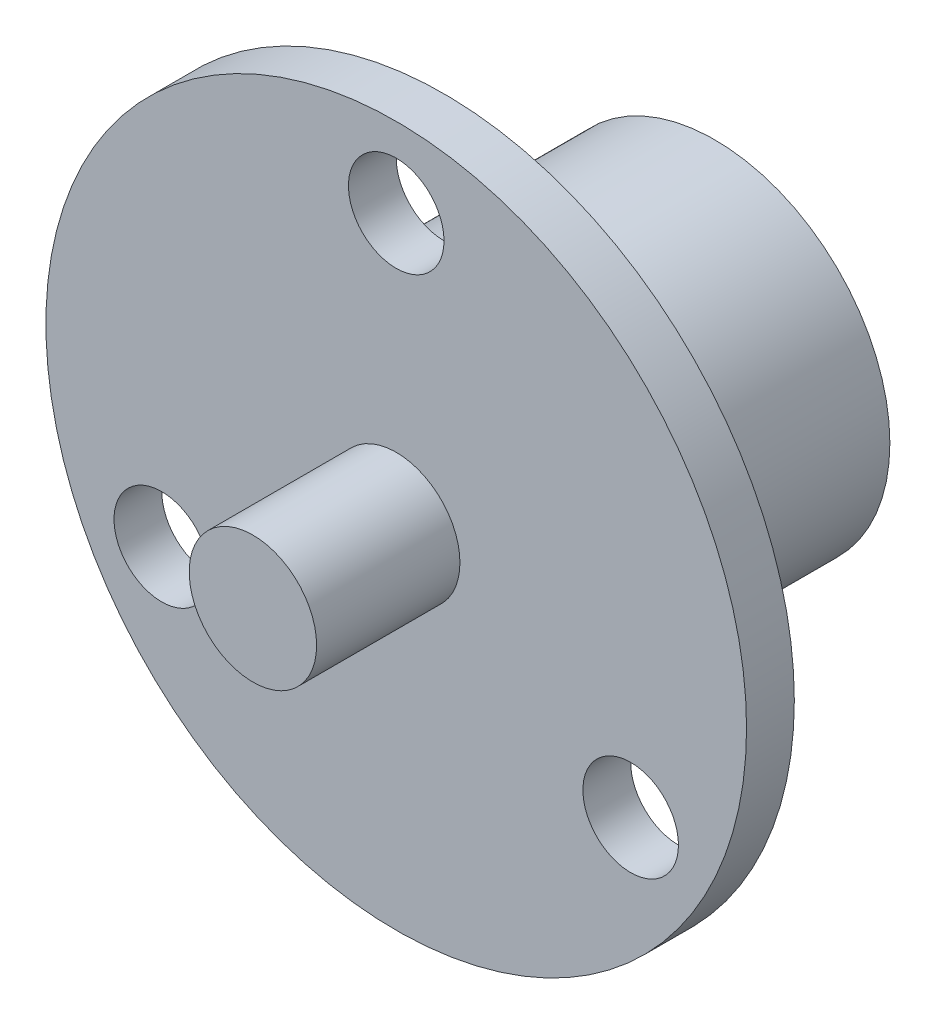
ISO-10303-21;
HEADER;
FILE_DESCRIPTION(('STEP AP214'),'2;1');
FILE_NAME('part.step','',(''),(''),'','','');
FILE_SCHEMA(('AUTOMOTIVE_DESIGN { 1 0 10303 214 1 1 1 1 }'));
ENDSEC;
DATA;
#1=APPLICATION_CONTEXT('core data for automotive mechanical design processes');
#2=APPLICATION_PROTOCOL_DEFINITION('international standard','automotive_design',2000,#1);
#3=PRODUCT_CONTEXT('',#1,'mechanical');
#4=PRODUCT('Part','Part','',(#3));
#5=PRODUCT_RELATED_PRODUCT_CATEGORY('part','',(#4));
#6=PRODUCT_DEFINITION_FORMATION('','',#4);
#7=PRODUCT_DEFINITION_CONTEXT('part definition',#1,'design');
#8=PRODUCT_DEFINITION('design','',#6,#7);
#9=PRODUCT_DEFINITION_SHAPE('','',#8);
#10=(LENGTH_UNIT() NAMED_UNIT(*) SI_UNIT(.MILLI.,.METRE.));
#11=(NAMED_UNIT(*) PLANE_ANGLE_UNIT() SI_UNIT($,.RADIAN.));
#12=(NAMED_UNIT(*) SI_UNIT($,.STERADIAN.) SOLID_ANGLE_UNIT());
#13=UNCERTAINTY_MEASURE_WITH_UNIT(LENGTH_MEASURE(1.E-05),#10,'distance_accuracy_value','');
#14=(GEOMETRIC_REPRESENTATION_CONTEXT(3) GLOBAL_UNCERTAINTY_ASSIGNED_CONTEXT((#13)) GLOBAL_UNIT_ASSIGNED_CONTEXT((#10,
#11,#12)) REPRESENTATION_CONTEXT('',''));
#15=CARTESIAN_POINT('',(0.,0.,0.));
#16=DIRECTION('',(0.,0.,1.));
#17=DIRECTION('',(1.,0.,0.));
#18=AXIS2_PLACEMENT_3D('',#15,#16,#17);
#19=CARTESIAN_POINT('',(0.,0.,17.));
#20=DIRECTION('',(0.,0.,-1.));
#21=DIRECTION('',(-1.,0.,0.));
#22=AXIS2_PLACEMENT_3D('',#19,#20,#21);
#23=CYLINDRICAL_SURFACE('',#22,11.);
#24=CARTESIAN_POINT('',(0.,0.,17.));
#25=DIRECTION('',(0.,0.,1.));
#26=DIRECTION('',(1.,0.,0.));
#27=AXIS2_PLACEMENT_3D('',#24,#25,#26);
#28=CIRCLE('',#27,11.);
#29=CARTESIAN_POINT('',(11.,0.,17.));
#30=VERTEX_POINT('',#29);
#31=EDGE_CURVE('E10',#30,#30,#28,.T.);
#32=ORIENTED_EDGE('',*,*,#31,.F.);
#33=EDGE_LOOP('',(#32));
#34=FACE_BOUND('',#33,.T.);
#35=CARTESIAN_POINT('',(0.,0.,0.));
#36=DIRECTION('',(0.,0.,1.));
#37=DIRECTION('',(1.,0.,0.));
#38=AXIS2_PLACEMENT_3D('',#35,#36,#37);
#39=CIRCLE('',#38,11.);
#40=CARTESIAN_POINT('',(11.,0.,0.));
#41=VERTEX_POINT('',#40);
#42=EDGE_CURVE('E34',#41,#41,#39,.T.);
#43=ORIENTED_EDGE('',*,*,#42,.T.);
#44=EDGE_LOOP('',(#43));
#45=FACE_BOUND('',#44,.T.);
#46=ADVANCED_FACE('F31',(#34,#45),#23,.T.);
#47=CARTESIAN_POINT('',(0.,0.,0.));
#48=DIRECTION('',(0.,0.,1.));
#49=DIRECTION('',(1.,0.,0.));
#50=AXIS2_PLACEMENT_3D('',#47,#48,#49);
#51=PLANE('',#50);
#52=ORIENTED_EDGE('',*,*,#42,.F.);
#53=EDGE_LOOP('',(#52));
#54=FACE_BOUND('',#53,.T.);
#55=ADVANCED_FACE('F92',(#54),#51,.F.);
#56=CARTESIAN_POINT('',(0.,0.,20.));
#57=DIRECTION('',(0.,0.,-1.));
#58=DIRECTION('',(-1.,0.,0.));
#59=AXIS2_PLACEMENT_3D('',#56,#57,#58);
#60=CYLINDRICAL_SURFACE('',#59,22.);
#61=CARTESIAN_POINT('',(0.,0.,20.));
#62=DIRECTION('',(0.,0.,1.));
#63=DIRECTION('',(1.,0.,0.));
#64=AXIS2_PLACEMENT_3D('',#61,#62,#63);
#65=CIRCLE('',#64,22.);
#66=CARTESIAN_POINT('',(22.,0.,20.));
#67=VERTEX_POINT('',#66);
#68=EDGE_CURVE('E41',#67,#67,#65,.T.);
#69=ORIENTED_EDGE('',*,*,#68,.F.);
#70=EDGE_LOOP('',(#69));
#71=FACE_BOUND('',#70,.T.);
#72=CARTESIAN_POINT('',(0.,0.,17.));
#73=DIRECTION('',(0.,0.,1.));
#74=DIRECTION('',(1.,0.,0.));
#75=AXIS2_PLACEMENT_3D('',#72,#73,#74);
#76=CIRCLE('',#75,22.);
#77=CARTESIAN_POINT('',(22.,0.,17.));
#78=VERTEX_POINT('',#77);
#79=EDGE_CURVE('E43',#78,#78,#76,.T.);
#80=ORIENTED_EDGE('',*,*,#79,.T.);
#81=EDGE_LOOP('',(#80));
#82=FACE_BOUND('',#81,.T.);
#83=ADVANCED_FACE('F80',(#71,#82),#60,.T.);
#84=CARTESIAN_POINT('',(0.,0.,20.));
#85=DIRECTION('',(0.,0.,1.));
#86=DIRECTION('',(1.,0.,0.));
#87=AXIS2_PLACEMENT_3D('',#84,#85,#86);
#88=PLANE('',#87);
#89=CARTESIAN_POINT('',(-14.7224318643347,-8.50000000000042,20.));
#90=DIRECTION('',(0.,0.,1.));
#91=DIRECTION('',(1.,0.,0.));
#92=AXIS2_PLACEMENT_3D('',#89,#90,#91);
#93=CIRCLE('',#92,3.00000000000097);
#94=CARTESIAN_POINT('',(-11.7224318643338,-8.50000000000042,20.));
#95=VERTEX_POINT('',#94);
#96=EDGE_CURVE('E69',#95,#95,#93,.T.);
#97=ORIENTED_EDGE('',*,*,#96,.F.);
#98=EDGE_LOOP('',(#97));
#99=FACE_BOUND('',#98,.T.);
#100=CARTESIAN_POINT('',(14.7224318643362,-8.49999999999958,20.));
#101=DIRECTION('',(0.,0.,1.));
#102=DIRECTION('',(1.,0.,0.));
#103=AXIS2_PLACEMENT_3D('',#100,#101,#102);
#104=CIRCLE('',#103,3.00000000000065);
#105=CARTESIAN_POINT('',(17.7224318643368,-8.49999999999958,20.));
#106=VERTEX_POINT('',#105);
#107=EDGE_CURVE('E63',#106,#106,#104,.T.);
#108=ORIENTED_EDGE('',*,*,#107,.F.);
#109=EDGE_LOOP('',(#108));
#110=FACE_BOUND('',#109,.T.);
#111=CARTESIAN_POINT('',(0.,17.,20.));
#112=DIRECTION('',(0.,0.,1.));
#113=DIRECTION('',(1.,0.,0.));
#114=AXIS2_PLACEMENT_3D('',#111,#112,#113);
#115=CIRCLE('',#114,3.);
#116=CARTESIAN_POINT('',(3.,17.,20.));
#117=VERTEX_POINT('',#116);
#118=EDGE_CURVE('E57',#117,#117,#115,.T.);
#119=ORIENTED_EDGE('',*,*,#118,.F.);
#120=EDGE_LOOP('',(#119));
#121=FACE_BOUND('',#120,.T.);
#122=CARTESIAN_POINT('',(0.,0.,20.));
#123=DIRECTION('',(0.,0.,1.));
#124=DIRECTION('',(1.,0.,0.));
#125=AXIS2_PLACEMENT_3D('',#122,#123,#124);
#126=CIRCLE('',#125,4.);
#127=CARTESIAN_POINT('',(4.,0.,20.));
#128=VERTEX_POINT('',#127);
#129=EDGE_CURVE('E49',#128,#128,#126,.T.);
#130=ORIENTED_EDGE('',*,*,#129,.F.);
#131=EDGE_LOOP('',(#130));
#132=FACE_BOUND('',#131,.T.);
#133=ORIENTED_EDGE('',*,*,#68,.T.);
#134=EDGE_LOOP('',(#133));
#135=FACE_BOUND('',#134,.T.);
#136=ADVANCED_FACE('F76',(#99,#110,#121,#132,#135),#88,.T.);
#137=CARTESIAN_POINT('',(0.,0.,17.));
#138=DIRECTION('',(0.,0.,1.));
#139=DIRECTION('',(1.,0.,0.));
#140=AXIS2_PLACEMENT_3D('',#137,#138,#139);
#141=PLANE('',#140);
#142=CARTESIAN_POINT('',(-14.7224318643347,-8.50000000000042,17.));
#143=DIRECTION('',(0.,0.,1.));
#144=DIRECTION('',(1.,0.,0.));
#145=AXIS2_PLACEMENT_3D('',#142,#143,#144);
#146=CIRCLE('',#145,3.00000000000097);
#147=CARTESIAN_POINT('',(-11.7224318643338,-8.50000000000042,17.));
#148=VERTEX_POINT('',#147);
#149=EDGE_CURVE('E66',#148,#148,#146,.F.);
#150=ORIENTED_EDGE('',*,*,#149,.F.);
#151=EDGE_LOOP('',(#150));
#152=FACE_BOUND('',#151,.T.);
#153=CARTESIAN_POINT('',(14.7224318643362,-8.49999999999958,17.));
#154=DIRECTION('',(0.,0.,1.));
#155=DIRECTION('',(1.,0.,0.));
#156=AXIS2_PLACEMENT_3D('',#153,#154,#155);
#157=CIRCLE('',#156,3.00000000000065);
#158=CARTESIAN_POINT('',(17.7224318643368,-8.49999999999958,17.));
#159=VERTEX_POINT('',#158);
#160=EDGE_CURVE('E60',#159,#159,#157,.F.);
#161=ORIENTED_EDGE('',*,*,#160,.F.);
#162=EDGE_LOOP('',(#161));
#163=FACE_BOUND('',#162,.T.);
#164=CARTESIAN_POINT('',(0.,17.,17.));
#165=DIRECTION('',(0.,0.,1.));
#166=DIRECTION('',(1.,0.,0.));
#167=AXIS2_PLACEMENT_3D('',#164,#165,#166);
#168=CIRCLE('',#167,3.);
#169=CARTESIAN_POINT('',(3.,17.,17.));
#170=VERTEX_POINT('',#169);
#171=EDGE_CURVE('E52',#170,#170,#168,.F.);
#172=ORIENTED_EDGE('',*,*,#171,.F.);
#173=EDGE_LOOP('',(#172));
#174=FACE_BOUND('',#173,.T.);
#175=ORIENTED_EDGE('',*,*,#31,.T.);
#176=EDGE_LOOP('',(#175));
#177=FACE_BOUND('',#176,.T.);
#178=ORIENTED_EDGE('',*,*,#79,.F.);
#179=EDGE_LOOP('',(#178));
#180=FACE_BOUND('',#179,.T.);
#181=ADVANCED_FACE('F79',(#152,#163,#174,#177,#180),#141,.F.);
#182=CARTESIAN_POINT('',(0.,0.,29.));
#183=DIRECTION('',(0.,0.,-1.));
#184=DIRECTION('',(-1.,0.,0.));
#185=AXIS2_PLACEMENT_3D('',#182,#183,#184);
#186=CYLINDRICAL_SURFACE('',#185,4.);
#187=CARTESIAN_POINT('',(0.,0.,29.));
#188=DIRECTION('',(0.,0.,1.));
#189=DIRECTION('',(1.,0.,0.));
#190=AXIS2_PLACEMENT_3D('',#187,#188,#189);
#191=CIRCLE('',#190,4.);
#192=CARTESIAN_POINT('',(4.,0.,29.));
#193=VERTEX_POINT('',#192);
#194=EDGE_CURVE('E46',#193,#193,#191,.T.);
#195=ORIENTED_EDGE('',*,*,#194,.F.);
#196=EDGE_LOOP('',(#195));
#197=FACE_BOUND('',#196,.T.);
#198=ORIENTED_EDGE('',*,*,#129,.T.);
#199=EDGE_LOOP('',(#198));
#200=FACE_BOUND('',#199,.T.);
#201=ADVANCED_FACE('F97',(#197,#200),#186,.T.);
#202=CARTESIAN_POINT('',(0.,0.,29.));
#203=DIRECTION('',(0.,0.,1.));
#204=DIRECTION('',(1.,0.,0.));
#205=AXIS2_PLACEMENT_3D('',#202,#203,#204);
#206=PLANE('',#205);
#207=ORIENTED_EDGE('',*,*,#194,.T.);
#208=EDGE_LOOP('',(#207));
#209=FACE_BOUND('',#208,.T.);
#210=ADVANCED_FACE('F103',(#209),#206,.T.);
#211=CARTESIAN_POINT('',(0.,17.,-0.001000000000001));
#212=DIRECTION('',(0.,0.,1.));
#213=DIRECTION('',(1.,0.,0.));
#214=AXIS2_PLACEMENT_3D('',#211,#212,#213);
#215=CYLINDRICAL_SURFACE('',#214,3.);
#216=ORIENTED_EDGE('',*,*,#118,.T.);
#217=EDGE_LOOP('',(#216));
#218=FACE_BOUND('',#217,.T.);
#219=ORIENTED_EDGE('',*,*,#171,.T.);
#220=EDGE_LOOP('',(#219));
#221=FACE_BOUND('',#220,.T.);
#222=ADVANCED_FACE('F141',(#218,#221),#215,.F.);
#223=CARTESIAN_POINT('',(14.7224318643362,-8.49999999999958,-0.001000000000001));
#224=DIRECTION('',(0.,0.,1.));
#225=DIRECTION('',(1.,0.,0.));
#226=AXIS2_PLACEMENT_3D('',#223,#224,#225);
#227=CYLINDRICAL_SURFACE('',#226,3.00000000000065);
#228=ORIENTED_EDGE('',*,*,#107,.T.);
#229=EDGE_LOOP('',(#228));
#230=FACE_BOUND('',#229,.T.);
#231=ORIENTED_EDGE('',*,*,#160,.T.);
#232=EDGE_LOOP('',(#231));
#233=FACE_BOUND('',#232,.T.);
#234=ADVANCED_FACE('F146',(#230,#233),#227,.F.);
#235=CARTESIAN_POINT('',(-14.7224318643347,-8.50000000000042,-0.001000000000001));
#236=DIRECTION('',(0.,0.,1.));
#237=DIRECTION('',(1.,0.,0.));
#238=AXIS2_PLACEMENT_3D('',#235,#236,#237);
#239=CYLINDRICAL_SURFACE('',#238,3.00000000000097);
#240=ORIENTED_EDGE('',*,*,#96,.T.);
#241=EDGE_LOOP('',(#240));
#242=FACE_BOUND('',#241,.T.);
#243=ORIENTED_EDGE('',*,*,#149,.T.);
#244=EDGE_LOOP('',(#243));
#245=FACE_BOUND('',#244,.T.);
#246=ADVANCED_FACE('F73',(#242,#245),#239,.F.);
#247=CLOSED_SHELL('',(#46,#55,#83,#136,#181,#201,#210,#222,#234,#246));
#248=MANIFOLD_SOLID_BREP('B2',#247);
#249=ADVANCED_BREP_SHAPE_REPRESENTATION('',(#18,#248),#14);
#250=SHAPE_DEFINITION_REPRESENTATION(#9,#249);
ENDSEC;
END-ISO-10303-21;
